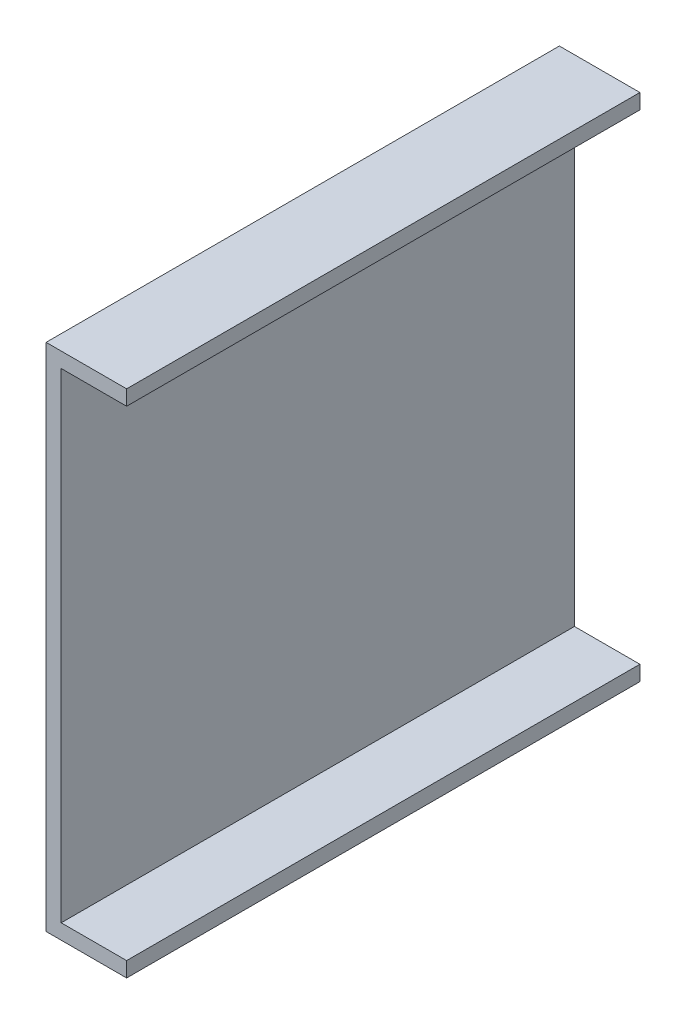
ISO-10303-21;
HEADER;
FILE_DESCRIPTION(('STEP AP214'),'2;1');
FILE_NAME('part.step','',(''),(''),'','','');
FILE_SCHEMA(('AUTOMOTIVE_DESIGN { 1 0 10303 214 1 1 1 1 }'));
ENDSEC;
DATA;
#1=APPLICATION_CONTEXT('core data for automotive mechanical design processes');
#2=APPLICATION_PROTOCOL_DEFINITION('international standard','automotive_design',2000,#1);
#3=PRODUCT_CONTEXT('',#1,'mechanical');
#4=PRODUCT('Part','Part','',(#3));
#5=PRODUCT_RELATED_PRODUCT_CATEGORY('part','',(#4));
#6=PRODUCT_DEFINITION_FORMATION('','',#4);
#7=PRODUCT_DEFINITION_CONTEXT('part definition',#1,'design');
#8=PRODUCT_DEFINITION('design','',#6,#7);
#9=PRODUCT_DEFINITION_SHAPE('','',#8);
#10=(LENGTH_UNIT() NAMED_UNIT(*) SI_UNIT(.MILLI.,.METRE.));
#11=(NAMED_UNIT(*) PLANE_ANGLE_UNIT() SI_UNIT($,.RADIAN.));
#12=(NAMED_UNIT(*) SI_UNIT($,.STERADIAN.) SOLID_ANGLE_UNIT());
#13=UNCERTAINTY_MEASURE_WITH_UNIT(LENGTH_MEASURE(1.E-05),#10,'distance_accuracy_value','');
#14=(GEOMETRIC_REPRESENTATION_CONTEXT(3) GLOBAL_UNCERTAINTY_ASSIGNED_CONTEXT((#13)) GLOBAL_UNIT_ASSIGNED_CONTEXT((#10,
#11,#12)) REPRESENTATION_CONTEXT('',''));
#15=CARTESIAN_POINT('',(0.,0.,0.));
#16=DIRECTION('',(0.,0.,1.));
#17=DIRECTION('',(1.,0.,0.));
#18=AXIS2_PLACEMENT_3D('',#15,#16,#17);
#19=CARTESIAN_POINT('',(0.,0.,510.));
#20=DIRECTION('',(1.,0.,0.));
#21=DIRECTION('',(0.,1.,0.));
#22=AXIS2_PLACEMENT_3D('',#19,#20,#21);
#23=PLANE('',#22);
#24=DIRECTION('',(0.,-1.,0.));
#25=VECTOR('',#24,1.);
#26=CARTESIAN_POINT('',(0.,0.,0.));
#27=LINE('',#26,#25);
#28=CARTESIAN_POINT('',(0.,0.,0.));
#29=VERTEX_POINT('',#28);
#30=CARTESIAN_POINT('',(0.,-507.,0.));
#31=VERTEX_POINT('',#30);
#32=EDGE_CURVE('E135',#29,#31,#27,.T.);
#33=ORIENTED_EDGE('',*,*,#32,.T.);
#34=DIRECTION('',(0.,0.,-1.));
#35=VECTOR('',#34,1.);
#36=CARTESIAN_POINT('',(0.,-507.,510.));
#37=LINE('',#36,#35);
#38=CARTESIAN_POINT('',(0.,-507.,510.));
#39=VERTEX_POINT('',#38);
#40=EDGE_CURVE('E11',#39,#31,#37,.T.);
#41=ORIENTED_EDGE('',*,*,#40,.F.);
#42=DIRECTION('',(0.,-1.,0.));
#43=VECTOR('',#42,1.);
#44=CARTESIAN_POINT('',(0.,0.,510.));
#45=LINE('',#44,#43);
#46=CARTESIAN_POINT('',(0.,0.,510.));
#47=VERTEX_POINT('',#46);
#48=EDGE_CURVE('E149',#47,#39,#45,.T.);
#49=ORIENTED_EDGE('',*,*,#48,.F.);
#50=DIRECTION('',(0.,0.,-1.));
#51=VECTOR('',#50,1.);
#52=CARTESIAN_POINT('',(0.,0.,510.));
#53=LINE('',#52,#51);
#54=EDGE_CURVE('E131',#47,#29,#53,.T.);
#55=ORIENTED_EDGE('',*,*,#54,.T.);
#56=EDGE_LOOP('',(#33,#41,#49,#55));
#57=FACE_BOUND('',#56,.T.);
#58=ADVANCED_FACE('F39',(#57),#23,.F.);
#59=CARTESIAN_POINT('',(0.,-507.,510.));
#60=DIRECTION('',(0.,1.,0.));
#61=DIRECTION('',(0.,0.,1.));
#62=AXIS2_PLACEMENT_3D('',#59,#60,#61);
#63=PLANE('',#62);
#64=DIRECTION('',(1.,0.,0.));
#65=VECTOR('',#64,1.);
#66=CARTESIAN_POINT('',(0.,-507.,0.));
#67=LINE('',#66,#65);
#68=CARTESIAN_POINT('',(80.,-507.,0.));
#69=VERTEX_POINT('',#68);
#70=EDGE_CURVE('E138',#31,#69,#67,.T.);
#71=ORIENTED_EDGE('',*,*,#70,.T.);
#72=DIRECTION('',(0.,0.,-1.));
#73=VECTOR('',#72,1.);
#74=CARTESIAN_POINT('',(80.,-507.,510.));
#75=LINE('',#74,#73);
#76=CARTESIAN_POINT('',(80.,-507.,510.));
#77=VERTEX_POINT('',#76);
#78=EDGE_CURVE('E47',#77,#69,#75,.T.);
#79=ORIENTED_EDGE('',*,*,#78,.F.);
#80=DIRECTION('',(1.,0.,0.));
#81=VECTOR('',#80,1.);
#82=CARTESIAN_POINT('',(0.,-507.,510.));
#83=LINE('',#82,#81);
#84=EDGE_CURVE('E98',#39,#77,#83,.T.);
#85=ORIENTED_EDGE('',*,*,#84,.F.);
#86=ORIENTED_EDGE('',*,*,#40,.T.);
#87=EDGE_LOOP('',(#71,#79,#85,#86));
#88=FACE_BOUND('',#87,.T.);
#89=ADVANCED_FACE('F184',(#88),#63,.F.);
#90=CARTESIAN_POINT('',(80.,-507.,510.));
#91=DIRECTION('',(-1.,0.,0.));
#92=DIRECTION('',(0.,0.,1.));
#93=AXIS2_PLACEMENT_3D('',#90,#91,#92);
#94=PLANE('',#93);
#95=DIRECTION('',(0.,1.,0.));
#96=VECTOR('',#95,1.);
#97=CARTESIAN_POINT('',(80.,-507.,0.));
#98=LINE('',#97,#96);
#99=CARTESIAN_POINT('',(80.,-492.,0.));
#100=VERTEX_POINT('',#99);
#101=EDGE_CURVE('E140',#69,#100,#98,.T.);
#102=ORIENTED_EDGE('',*,*,#101,.T.);
#103=DIRECTION('',(0.,0.,-1.));
#104=VECTOR('',#103,1.);
#105=CARTESIAN_POINT('',(80.,-492.,510.));
#106=LINE('',#105,#104);
#107=CARTESIAN_POINT('',(80.,-492.,510.));
#108=VERTEX_POINT('',#107);
#109=EDGE_CURVE('E156',#108,#100,#106,.T.);
#110=ORIENTED_EDGE('',*,*,#109,.F.);
#111=DIRECTION('',(0.,1.,0.));
#112=VECTOR('',#111,1.);
#113=CARTESIAN_POINT('',(80.,-507.,510.));
#114=LINE('',#113,#112);
#115=EDGE_CURVE('E164',#77,#108,#114,.T.);
#116=ORIENTED_EDGE('',*,*,#115,.F.);
#117=ORIENTED_EDGE('',*,*,#78,.T.);
#118=EDGE_LOOP('',(#102,#110,#116,#117));
#119=FACE_BOUND('',#118,.T.);
#120=ADVANCED_FACE('F162',(#119),#94,.F.);
#121=CARTESIAN_POINT('',(15.,-492.,510.));
#122=DIRECTION('',(0.,-1.,0.));
#123=DIRECTION('',(0.,0.,-1.));
#124=AXIS2_PLACEMENT_3D('',#121,#122,#123);
#125=PLANE('',#124);
#126=DIRECTION('',(-1.,0.,0.));
#127=VECTOR('',#126,1.);
#128=CARTESIAN_POINT('',(15.,-492.,0.));
#129=LINE('',#128,#127);
#130=CARTESIAN_POINT('',(15.,-492.,0.));
#131=VERTEX_POINT('',#130);
#132=EDGE_CURVE('E142',#100,#131,#129,.T.);
#133=ORIENTED_EDGE('',*,*,#132,.T.);
#134=DIRECTION('',(0.,0.,-1.));
#135=VECTOR('',#134,1.);
#136=CARTESIAN_POINT('',(15.,-492.,510.));
#137=LINE('',#136,#135);
#138=CARTESIAN_POINT('',(15.,-492.,510.));
#139=VERTEX_POINT('',#138);
#140=EDGE_CURVE('E153',#139,#131,#137,.T.);
#141=ORIENTED_EDGE('',*,*,#140,.F.);
#142=DIRECTION('',(-1.,0.,0.));
#143=VECTOR('',#142,1.);
#144=CARTESIAN_POINT('',(15.,-492.,510.));
#145=LINE('',#144,#143);
#146=EDGE_CURVE('E176',#108,#139,#145,.T.);
#147=ORIENTED_EDGE('',*,*,#146,.F.);
#148=ORIENTED_EDGE('',*,*,#109,.T.);
#149=EDGE_LOOP('',(#133,#141,#147,#148));
#150=FACE_BOUND('',#149,.T.);
#151=ADVANCED_FACE('F172',(#150),#125,.F.);
#152=CARTESIAN_POINT('',(15.,-15.,510.));
#153=DIRECTION('',(-1.,0.,0.));
#154=DIRECTION('',(0.,0.,1.));
#155=AXIS2_PLACEMENT_3D('',#152,#153,#154);
#156=PLANE('',#155);
#157=DIRECTION('',(0.,1.,0.));
#158=VECTOR('',#157,1.);
#159=CARTESIAN_POINT('',(15.,-15.,0.));
#160=LINE('',#159,#158);
#161=CARTESIAN_POINT('',(15.,-15.,0.));
#162=VERTEX_POINT('',#161);
#163=EDGE_CURVE('E144',#131,#162,#160,.T.);
#164=ORIENTED_EDGE('',*,*,#163,.T.);
#165=DIRECTION('',(0.,0.,-1.));
#166=VECTOR('',#165,1.);
#167=CARTESIAN_POINT('',(15.,-15.,510.));
#168=LINE('',#167,#166);
#169=CARTESIAN_POINT('',(15.,-15.,510.));
#170=VERTEX_POINT('',#169);
#171=EDGE_CURVE('E126',#170,#162,#168,.T.);
#172=ORIENTED_EDGE('',*,*,#171,.F.);
#173=DIRECTION('',(0.,1.,0.));
#174=VECTOR('',#173,1.);
#175=CARTESIAN_POINT('',(15.,-15.,510.));
#176=LINE('',#175,#174);
#177=EDGE_CURVE('E117',#139,#170,#176,.T.);
#178=ORIENTED_EDGE('',*,*,#177,.F.);
#179=ORIENTED_EDGE('',*,*,#140,.T.);
#180=EDGE_LOOP('',(#164,#172,#178,#179));
#181=FACE_BOUND('',#180,.T.);
#182=ADVANCED_FACE('F175',(#181),#156,.F.);
#183=CARTESIAN_POINT('',(80.,-15.,510.));
#184=DIRECTION('',(0.,1.,0.));
#185=DIRECTION('',(-1.,0.,0.));
#186=AXIS2_PLACEMENT_3D('',#183,#184,#185);
#187=PLANE('',#186);
#188=DIRECTION('',(1.,0.,0.));
#189=VECTOR('',#188,1.);
#190=CARTESIAN_POINT('',(80.,-15.,0.));
#191=LINE('',#190,#189);
#192=CARTESIAN_POINT('',(80.,-15.,0.));
#193=VERTEX_POINT('',#192);
#194=EDGE_CURVE('E125',#162,#193,#191,.T.);
#195=ORIENTED_EDGE('',*,*,#194,.T.);
#196=DIRECTION('',(0.,0.,-1.));
#197=VECTOR('',#196,1.);
#198=CARTESIAN_POINT('',(80.,-15.,510.));
#199=LINE('',#198,#197);
#200=CARTESIAN_POINT('',(80.,-15.,510.));
#201=VERTEX_POINT('',#200);
#202=EDGE_CURVE('E122',#201,#193,#199,.T.);
#203=ORIENTED_EDGE('',*,*,#202,.F.);
#204=DIRECTION('',(1.,0.,0.));
#205=VECTOR('',#204,1.);
#206=CARTESIAN_POINT('',(80.,-15.,510.));
#207=LINE('',#206,#205);
#208=EDGE_CURVE('E111',#170,#201,#207,.T.);
#209=ORIENTED_EDGE('',*,*,#208,.F.);
#210=ORIENTED_EDGE('',*,*,#171,.T.);
#211=EDGE_LOOP('',(#195,#203,#209,#210));
#212=FACE_BOUND('',#211,.T.);
#213=ADVANCED_FACE('F123',(#212),#187,.F.);
#214=CARTESIAN_POINT('',(80.,0.,510.));
#215=DIRECTION('',(-1.,0.,0.));
#216=DIRECTION('',(0.,0.,1.));
#217=AXIS2_PLACEMENT_3D('',#214,#215,#216);
#218=PLANE('',#217);
#219=DIRECTION('',(0.,1.,0.));
#220=VECTOR('',#219,1.);
#221=CARTESIAN_POINT('',(80.,0.,0.));
#222=LINE('',#221,#220);
#223=CARTESIAN_POINT('',(80.,0.,0.));
#224=VERTEX_POINT('',#223);
#225=EDGE_CURVE('E84',#193,#224,#222,.T.);
#226=ORIENTED_EDGE('',*,*,#225,.T.);
#227=DIRECTION('',(0.,0.,-1.));
#228=VECTOR('',#227,1.);
#229=CARTESIAN_POINT('',(80.,0.,510.));
#230=LINE('',#229,#228);
#231=CARTESIAN_POINT('',(80.,0.,510.));
#232=VERTEX_POINT('',#231);
#233=EDGE_CURVE('E127',#232,#224,#230,.T.);
#234=ORIENTED_EDGE('',*,*,#233,.F.);
#235=DIRECTION('',(0.,1.,0.));
#236=VECTOR('',#235,1.);
#237=CARTESIAN_POINT('',(80.,0.,510.));
#238=LINE('',#237,#236);
#239=EDGE_CURVE('E115',#201,#232,#238,.T.);
#240=ORIENTED_EDGE('',*,*,#239,.F.);
#241=ORIENTED_EDGE('',*,*,#202,.T.);
#242=EDGE_LOOP('',(#226,#234,#240,#241));
#243=FACE_BOUND('',#242,.T.);
#244=ADVANCED_FACE('F129',(#243),#218,.F.);
#245=CARTESIAN_POINT('',(0.,0.,510.));
#246=DIRECTION('',(0.,-1.,0.));
#247=DIRECTION('',(0.,0.,-1.));
#248=AXIS2_PLACEMENT_3D('',#245,#246,#247);
#249=PLANE('',#248);
#250=DIRECTION('',(-1.,0.,0.));
#251=VECTOR('',#250,1.);
#252=CARTESIAN_POINT('',(0.,0.,0.));
#253=LINE('',#252,#251);
#254=EDGE_CURVE('E90',#224,#29,#253,.T.);
#255=ORIENTED_EDGE('',*,*,#254,.T.);
#256=ORIENTED_EDGE('',*,*,#54,.F.);
#257=DIRECTION('',(-1.,0.,0.));
#258=VECTOR('',#257,1.);
#259=CARTESIAN_POINT('',(0.,0.,510.));
#260=LINE('',#259,#258);
#261=EDGE_CURVE('E55',#232,#47,#260,.T.);
#262=ORIENTED_EDGE('',*,*,#261,.F.);
#263=ORIENTED_EDGE('',*,*,#233,.T.);
#264=EDGE_LOOP('',(#255,#256,#262,#263));
#265=FACE_BOUND('',#264,.T.);
#266=ADVANCED_FACE('F200',(#265),#249,.F.);
#267=CARTESIAN_POINT('',(0.,0.,510.));
#268=DIRECTION('',(0.,0.,1.));
#269=DIRECTION('',(1.,0.,0.));
#270=AXIS2_PLACEMENT_3D('',#267,#268,#269);
#271=PLANE('',#270);
#272=ORIENTED_EDGE('',*,*,#48,.T.);
#273=ORIENTED_EDGE('',*,*,#84,.T.);
#274=ORIENTED_EDGE('',*,*,#115,.T.);
#275=ORIENTED_EDGE('',*,*,#146,.T.);
#276=ORIENTED_EDGE('',*,*,#177,.T.);
#277=ORIENTED_EDGE('',*,*,#208,.T.);
#278=ORIENTED_EDGE('',*,*,#239,.T.);
#279=ORIENTED_EDGE('',*,*,#261,.T.);
#280=EDGE_LOOP('',(#272,#273,#274,#275,#276,#277,#278,#279));
#281=FACE_BOUND('',#280,.T.);
#282=ADVANCED_FACE('F113',(#281),#271,.T.);
#283=CARTESIAN_POINT('',(0.,0.,0.));
#284=DIRECTION('',(0.,0.,1.));
#285=DIRECTION('',(1.,0.,0.));
#286=AXIS2_PLACEMENT_3D('',#283,#284,#285);
#287=PLANE('',#286);
#288=ORIENTED_EDGE('',*,*,#32,.F.);
#289=ORIENTED_EDGE('',*,*,#254,.F.);
#290=ORIENTED_EDGE('',*,*,#225,.F.);
#291=ORIENTED_EDGE('',*,*,#194,.F.);
#292=ORIENTED_EDGE('',*,*,#163,.F.);
#293=ORIENTED_EDGE('',*,*,#132,.F.);
#294=ORIENTED_EDGE('',*,*,#101,.F.);
#295=ORIENTED_EDGE('',*,*,#70,.F.);
#296=EDGE_LOOP('',(#288,#289,#290,#291,#292,#293,#294,#295));
#297=FACE_BOUND('',#296,.T.);
#298=ADVANCED_FACE('F168',(#297),#287,.F.);
#299=CLOSED_SHELL('',(#58,#89,#120,#151,#182,#213,#244,#266,#282,#298));
#300=MANIFOLD_SOLID_BREP('B2',#299);
#301=ADVANCED_BREP_SHAPE_REPRESENTATION('',(#18,#300),#14);
#302=SHAPE_DEFINITION_REPRESENTATION(#9,#301);
ENDSEC;
END-ISO-10303-21;
